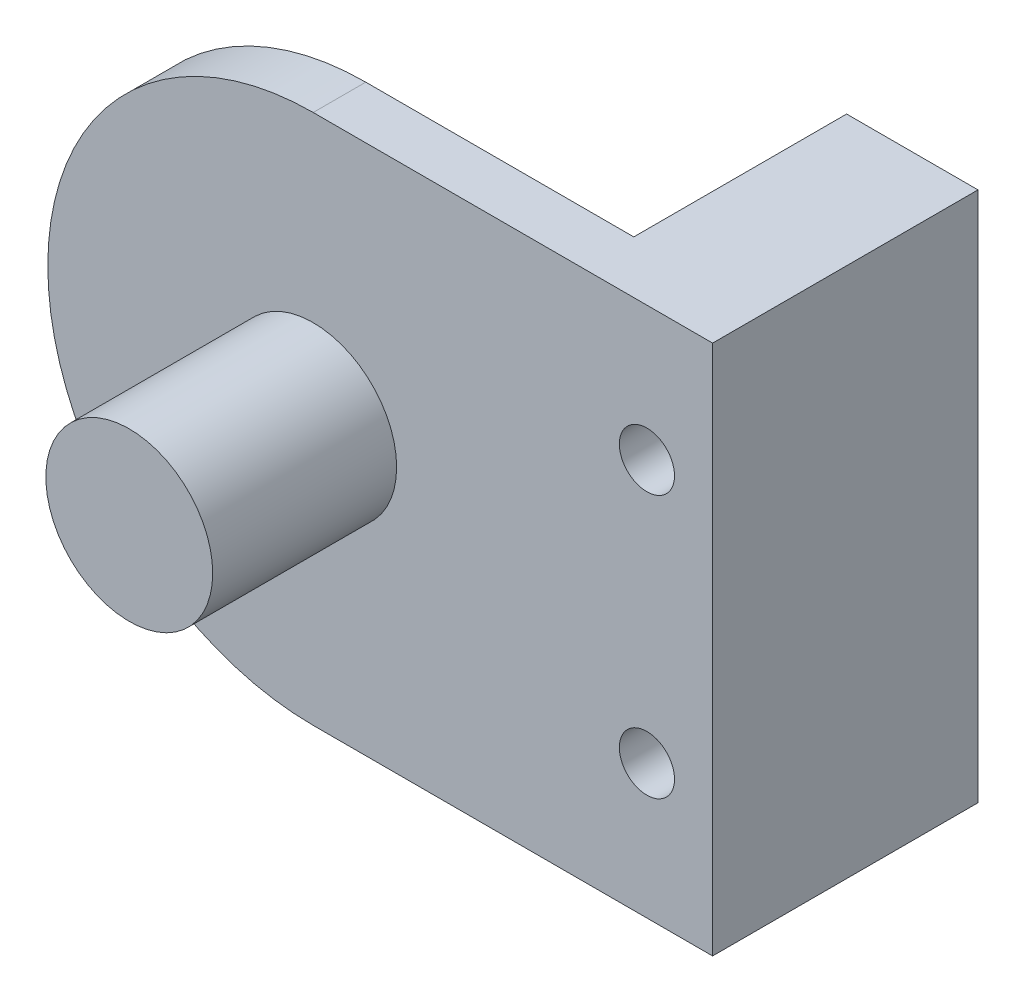
ISO-10303-21;
HEADER;
FILE_DESCRIPTION(('STEP AP214'),'2;1');
FILE_NAME('part.step','',(''),(''),'','','');
FILE_SCHEMA(('AUTOMOTIVE_DESIGN { 1 0 10303 214 1 1 1 1 }'));
ENDSEC;
DATA;
#1=APPLICATION_CONTEXT('core data for automotive mechanical design processes');
#2=APPLICATION_PROTOCOL_DEFINITION('international standard','automotive_design',2000,#1);
#3=PRODUCT_CONTEXT('',#1,'mechanical');
#4=PRODUCT('Part','Part','',(#3));
#5=PRODUCT_RELATED_PRODUCT_CATEGORY('part','',(#4));
#6=PRODUCT_DEFINITION_FORMATION('','',#4);
#7=PRODUCT_DEFINITION_CONTEXT('part definition',#1,'design');
#8=PRODUCT_DEFINITION('design','',#6,#7);
#9=PRODUCT_DEFINITION_SHAPE('','',#8);
#10=(LENGTH_UNIT() NAMED_UNIT(*) SI_UNIT(.MILLI.,.METRE.));
#11=(NAMED_UNIT(*) PLANE_ANGLE_UNIT() SI_UNIT($,.RADIAN.));
#12=(NAMED_UNIT(*) SI_UNIT($,.STERADIAN.) SOLID_ANGLE_UNIT());
#13=UNCERTAINTY_MEASURE_WITH_UNIT(LENGTH_MEASURE(1.E-05),#10,'distance_accuracy_value','');
#14=(GEOMETRIC_REPRESENTATION_CONTEXT(3) GLOBAL_UNCERTAINTY_ASSIGNED_CONTEXT((#13)) GLOBAL_UNIT_ASSIGNED_CONTEXT((#10,
#11,#12)) REPRESENTATION_CONTEXT('',''));
#15=CARTESIAN_POINT('',(0.,0.,0.));
#16=DIRECTION('',(0.,0.,1.));
#17=DIRECTION('',(1.,0.,0.));
#18=AXIS2_PLACEMENT_3D('',#15,#16,#17);
#19=CARTESIAN_POINT('',(2.5,10.1,8.1));
#20=DIRECTION('',(-1.,0.,0.));
#21=DIRECTION('',(0.,-1.,0.));
#22=AXIS2_PLACEMENT_3D('',#19,#20,#21);
#23=PLANE('',#22);
#24=DIRECTION('',(0.,1.,0.));
#25=VECTOR('',#24,1.);
#26=CARTESIAN_POINT('',(2.5,10.1,0.));
#27=LINE('',#26,#25);
#28=CARTESIAN_POINT('',(2.5,-10.1,0.));
#29=VERTEX_POINT('',#28);
#30=CARTESIAN_POINT('',(2.5,10.1,0.));
#31=VERTEX_POINT('',#30);
#32=EDGE_CURVE('E97',#29,#31,#27,.T.);
#33=ORIENTED_EDGE('',*,*,#32,.T.);
#34=DIRECTION('',(0.,0.,-1.));
#35=VECTOR('',#34,1.);
#36=CARTESIAN_POINT('',(2.5,10.1,8.1));
#37=LINE('',#36,#35);
#38=CARTESIAN_POINT('',(2.5,10.1,10.1));
#39=VERTEX_POINT('',#38);
#40=EDGE_CURVE('E11',#39,#31,#37,.T.);
#41=ORIENTED_EDGE('',*,*,#40,.F.);
#42=DIRECTION('',(0.,1.,0.));
#43=VECTOR('',#42,1.);
#44=CARTESIAN_POINT('',(2.5,10.1,10.1));
#45=LINE('',#44,#43);
#46=CARTESIAN_POINT('',(2.5,-10.1,10.1));
#47=VERTEX_POINT('',#46);
#48=EDGE_CURVE('E135',#47,#39,#45,.T.);
#49=ORIENTED_EDGE('',*,*,#48,.F.);
#50=DIRECTION('',(0.,0.,-1.));
#51=VECTOR('',#50,1.);
#52=CARTESIAN_POINT('',(2.5,-10.1,8.1));
#53=LINE('',#52,#51);
#54=EDGE_CURVE('E92',#47,#29,#53,.T.);
#55=ORIENTED_EDGE('',*,*,#54,.T.);
#56=EDGE_LOOP('',(#33,#41,#49,#55));
#57=FACE_BOUND('',#56,.T.);
#58=ADVANCED_FACE('F39',(#57),#23,.F.);
#59=CARTESIAN_POINT('',(-2.5,10.1,8.1));
#60=DIRECTION('',(0.,-1.,0.));
#61=DIRECTION('',(0.,0.,-1.));
#62=AXIS2_PLACEMENT_3D('',#59,#60,#61);
#63=PLANE('',#62);
#64=DIRECTION('',(-1.,0.,0.));
#65=VECTOR('',#64,1.);
#66=CARTESIAN_POINT('',(-2.5,10.1,0.));
#67=LINE('',#66,#65);
#68=CARTESIAN_POINT('',(-2.5,10.1,0.));
#69=VERTEX_POINT('',#68);
#70=EDGE_CURVE('E81',#31,#69,#67,.T.);
#71=ORIENTED_EDGE('',*,*,#70,.T.);
#72=DIRECTION('',(0.,0.,-1.));
#73=VECTOR('',#72,1.);
#74=CARTESIAN_POINT('',(-2.5,10.1,8.1));
#75=LINE('',#74,#73);
#76=CARTESIAN_POINT('',(-2.5,10.1,8.1));
#77=VERTEX_POINT('',#76);
#78=EDGE_CURVE('E49',#77,#69,#75,.T.);
#79=ORIENTED_EDGE('',*,*,#78,.F.);
#80=DIRECTION('',(-1.,0.,0.));
#81=VECTOR('',#80,1.);
#82=CARTESIAN_POINT('',(2.5,10.1,8.1));
#83=LINE('',#82,#81);
#84=CARTESIAN_POINT('',(-12.7,10.1,8.1));
#85=VERTEX_POINT('',#84);
#86=EDGE_CURVE('E131',#77,#85,#83,.T.);
#87=ORIENTED_EDGE('',*,*,#86,.T.);
#88=DIRECTION('',(0.,0.,-1.));
#89=VECTOR('',#88,1.);
#90=CARTESIAN_POINT('',(-12.7,10.1,10.1));
#91=LINE('',#90,#89);
#92=CARTESIAN_POINT('',(-12.7,10.1,10.1));
#93=VERTEX_POINT('',#92);
#94=EDGE_CURVE('E162',#93,#85,#91,.T.);
#95=ORIENTED_EDGE('',*,*,#94,.F.);
#96=DIRECTION('',(-1.,0.,0.));
#97=VECTOR('',#96,1.);
#98=CARTESIAN_POINT('',(2.5,10.1,10.1));
#99=LINE('',#98,#97);
#100=EDGE_CURVE('E139',#39,#93,#99,.T.);
#101=ORIENTED_EDGE('',*,*,#100,.F.);
#102=ORIENTED_EDGE('',*,*,#40,.T.);
#103=EDGE_LOOP('',(#71,#79,#87,#95,#101,#102));
#104=FACE_BOUND('',#103,.T.);
#105=ADVANCED_FACE('F168',(#104),#63,.F.);
#106=CARTESIAN_POINT('',(-2.5,10.1,8.1));
#107=DIRECTION('',(1.,0.,0.));
#108=DIRECTION('',(0.,1.,0.));
#109=AXIS2_PLACEMENT_3D('',#106,#107,#108);
#110=PLANE('',#109);
#111=DIRECTION('',(0.,-1.,0.));
#112=VECTOR('',#111,1.);
#113=CARTESIAN_POINT('',(-2.5,10.1,0.));
#114=LINE('',#113,#112);
#115=CARTESIAN_POINT('',(-2.5,-10.1,0.));
#116=VERTEX_POINT('',#115);
#117=EDGE_CURVE('E72',#69,#116,#114,.T.);
#118=ORIENTED_EDGE('',*,*,#117,.T.);
#119=DIRECTION('',(0.,0.,-1.));
#120=VECTOR('',#119,1.);
#121=CARTESIAN_POINT('',(-2.5,-10.1,8.1));
#122=LINE('',#121,#120);
#123=CARTESIAN_POINT('',(-2.5,-10.1,8.1));
#124=VERTEX_POINT('',#123);
#125=EDGE_CURVE('E75',#124,#116,#122,.T.);
#126=ORIENTED_EDGE('',*,*,#125,.F.);
#127=DIRECTION('',(0.,-1.,0.));
#128=VECTOR('',#127,1.);
#129=CARTESIAN_POINT('',(-2.5,10.1,8.1));
#130=LINE('',#129,#128);
#131=EDGE_CURVE('E99',#77,#124,#130,.T.);
#132=ORIENTED_EDGE('',*,*,#131,.F.);
#133=ORIENTED_EDGE('',*,*,#78,.T.);
#134=EDGE_LOOP('',(#118,#126,#132,#133));
#135=FACE_BOUND('',#134,.T.);
#136=ADVANCED_FACE('F74',(#135),#110,.F.);
#137=CARTESIAN_POINT('',(-2.5,-10.1,8.1));
#138=DIRECTION('',(0.,1.,0.));
#139=DIRECTION('',(0.,0.,1.));
#140=AXIS2_PLACEMENT_3D('',#137,#138,#139);
#141=PLANE('',#140);
#142=DIRECTION('',(1.,0.,0.));
#143=VECTOR('',#142,1.);
#144=CARTESIAN_POINT('',(-2.5,-10.1,0.));
#145=LINE('',#144,#143);
#146=EDGE_CURVE('E80',#116,#29,#145,.T.);
#147=ORIENTED_EDGE('',*,*,#146,.T.);
#148=ORIENTED_EDGE('',*,*,#54,.F.);
#149=DIRECTION('',(1.,0.,0.));
#150=VECTOR('',#149,1.);
#151=CARTESIAN_POINT('',(2.5,-10.1,10.1));
#152=LINE('',#151,#150);
#153=CARTESIAN_POINT('',(-12.7,-10.1,10.1));
#154=VERTEX_POINT('',#153);
#155=EDGE_CURVE('E147',#154,#47,#152,.T.);
#156=ORIENTED_EDGE('',*,*,#155,.F.);
#157=DIRECTION('',(0.,0.,-1.));
#158=VECTOR('',#157,1.);
#159=CARTESIAN_POINT('',(-12.7,-10.1,10.1));
#160=LINE('',#159,#158);
#161=CARTESIAN_POINT('',(-12.7,-10.1,8.1));
#162=VERTEX_POINT('',#161);
#163=EDGE_CURVE('E151',#154,#162,#160,.T.);
#164=ORIENTED_EDGE('',*,*,#163,.T.);
#165=DIRECTION('',(1.,0.,0.));
#166=VECTOR('',#165,1.);
#167=CARTESIAN_POINT('',(2.5,-10.1,8.1));
#168=LINE('',#167,#166);
#169=EDGE_CURVE('E90',#162,#124,#168,.T.);
#170=ORIENTED_EDGE('',*,*,#169,.T.);
#171=ORIENTED_EDGE('',*,*,#125,.T.);
#172=EDGE_LOOP('',(#147,#148,#156,#164,#170,#171));
#173=FACE_BOUND('',#172,.T.);
#174=ADVANCED_FACE('F85',(#173),#141,.F.);
#175=CARTESIAN_POINT('',(0.,0.,0.));
#176=DIRECTION('',(0.,0.,1.));
#177=DIRECTION('',(1.,0.,0.));
#178=AXIS2_PLACEMENT_3D('',#175,#176,#177);
#179=PLANE('',#178);
#180=CARTESIAN_POINT('',(0.,5.,0.));
#181=DIRECTION('',(0.,0.,-1.));
#182=DIRECTION('',(-1.,0.,0.));
#183=AXIS2_PLACEMENT_3D('',#180,#181,#182);
#184=CIRCLE('',#183,1.05);
#185=CARTESIAN_POINT('',(-1.05,5.,0.));
#186=VERTEX_POINT('',#185);
#187=EDGE_CURVE('E111',#186,#186,#184,.T.);
#188=ORIENTED_EDGE('',*,*,#187,.F.);
#189=EDGE_LOOP('',(#188));
#190=FACE_BOUND('',#189,.T.);
#191=CARTESIAN_POINT('',(-1.03877078427306E-13,-5.,0.));
#192=DIRECTION('',(0.,0.,-1.));
#193=DIRECTION('',(-1.,0.,0.));
#194=AXIS2_PLACEMENT_3D('',#191,#192,#193);
#195=CIRCLE('',#194,1.05);
#196=CARTESIAN_POINT('',(-1.0500000000001,-5.,0.));
#197=VERTEX_POINT('',#196);
#198=EDGE_CURVE('E119',#197,#197,#195,.T.);
#199=ORIENTED_EDGE('',*,*,#198,.F.);
#200=EDGE_LOOP('',(#199));
#201=FACE_BOUND('',#200,.T.);
#202=ORIENTED_EDGE('',*,*,#32,.F.);
#203=ORIENTED_EDGE('',*,*,#146,.F.);
#204=ORIENTED_EDGE('',*,*,#117,.F.);
#205=ORIENTED_EDGE('',*,*,#70,.F.);
#206=EDGE_LOOP('',(#202,#203,#204,#205));
#207=FACE_BOUND('',#206,.T.);
#208=ADVANCED_FACE('F95',(#190,#201,#207),#179,.F.);
#209=CARTESIAN_POINT('',(-12.7,0.,8.1));
#210=DIRECTION('',(0.,0.,1.));
#211=DIRECTION('',(1.,0.,0.));
#212=AXIS2_PLACEMENT_3D('',#209,#210,#211);
#213=PLANE('',#212);
#214=ORIENTED_EDGE('',*,*,#86,.F.);
#215=ORIENTED_EDGE('',*,*,#131,.T.);
#216=ORIENTED_EDGE('',*,*,#169,.F.);
#217=CARTESIAN_POINT('',(-12.7,0.,8.1));
#218=DIRECTION('',(0.,0.,1.));
#219=DIRECTION('',(1.,0.,0.));
#220=AXIS2_PLACEMENT_3D('',#217,#218,#219);
#221=CIRCLE('',#220,10.1);
#222=EDGE_CURVE('E154',#85,#162,#221,.T.);
#223=ORIENTED_EDGE('',*,*,#222,.F.);
#224=EDGE_LOOP('',(#214,#215,#216,#223));
#225=FACE_BOUND('',#224,.T.);
#226=ADVANCED_FACE('F192',(#225),#213,.F.);
#227=CARTESIAN_POINT('',(-12.7,0.,10.1));
#228=DIRECTION('',(0.,0.,-1.));
#229=DIRECTION('',(-1.,0.,0.));
#230=AXIS2_PLACEMENT_3D('',#227,#228,#229);
#231=CYLINDRICAL_SURFACE('',#230,10.1);
#232=ORIENTED_EDGE('',*,*,#222,.T.);
#233=ORIENTED_EDGE('',*,*,#163,.F.);
#234=CARTESIAN_POINT('',(-12.7,0.,10.1));
#235=DIRECTION('',(0.,0.,1.));
#236=DIRECTION('',(1.,0.,0.));
#237=AXIS2_PLACEMENT_3D('',#234,#235,#236);
#238=CIRCLE('',#237,10.1);
#239=EDGE_CURVE('E143',#93,#154,#238,.T.);
#240=ORIENTED_EDGE('',*,*,#239,.F.);
#241=ORIENTED_EDGE('',*,*,#94,.T.);
#242=EDGE_LOOP('',(#232,#233,#240,#241));
#243=FACE_BOUND('',#242,.T.);
#244=ADVANCED_FACE('F186',(#243),#231,.T.);
#245=CARTESIAN_POINT('',(-12.7,0.,10.1));
#246=DIRECTION('',(0.,0.,1.));
#247=DIRECTION('',(1.,0.,0.));
#248=AXIS2_PLACEMENT_3D('',#245,#246,#247);
#249=PLANE('',#248);
#250=CARTESIAN_POINT('',(0.,5.,10.1));
#251=DIRECTION('',(0.,0.,1.));
#252=DIRECTION('',(1.,0.,0.));
#253=AXIS2_PLACEMENT_3D('',#250,#251,#252);
#254=CIRCLE('',#253,1.05);
#255=CARTESIAN_POINT('',(1.05,5.,10.1));
#256=VERTEX_POINT('',#255);
#257=EDGE_CURVE('E42',#256,#256,#254,.T.);
#258=ORIENTED_EDGE('',*,*,#257,.F.);
#259=EDGE_LOOP('',(#258));
#260=FACE_BOUND('',#259,.T.);
#261=CARTESIAN_POINT('',(-1.03877078427306E-13,-5.,10.1));
#262=DIRECTION('',(0.,0.,1.));
#263=DIRECTION('',(1.,0.,0.));
#264=AXIS2_PLACEMENT_3D('',#261,#262,#263);
#265=CIRCLE('',#264,1.05);
#266=CARTESIAN_POINT('',(1.0499999999999,-5.,10.1));
#267=VERTEX_POINT('',#266);
#268=EDGE_CURVE('E108',#267,#267,#265,.T.);
#269=ORIENTED_EDGE('',*,*,#268,.F.);
#270=EDGE_LOOP('',(#269));
#271=FACE_BOUND('',#270,.T.);
#272=CARTESIAN_POINT('',(-12.7,0.,10.1));
#273=DIRECTION('',(0.,0.,1.));
#274=DIRECTION('',(1.,0.,0.));
#275=AXIS2_PLACEMENT_3D('',#272,#273,#274);
#276=CIRCLE('',#275,3.175);
#277=CARTESIAN_POINT('',(-9.525,0.,10.1));
#278=VERTEX_POINT('',#277);
#279=EDGE_CURVE('E117',#278,#278,#276,.T.);
#280=ORIENTED_EDGE('',*,*,#279,.F.);
#281=EDGE_LOOP('',(#280));
#282=FACE_BOUND('',#281,.T.);
#283=ORIENTED_EDGE('',*,*,#48,.T.);
#284=ORIENTED_EDGE('',*,*,#100,.T.);
#285=ORIENTED_EDGE('',*,*,#239,.T.);
#286=ORIENTED_EDGE('',*,*,#155,.T.);
#287=EDGE_LOOP('',(#283,#284,#285,#286));
#288=FACE_BOUND('',#287,.T.);
#289=ADVANCED_FACE('F180',(#260,#271,#282,#288),#249,.T.);
#290=CARTESIAN_POINT('',(-12.7,0.,17.1));
#291=DIRECTION('',(0.,0.,-1.));
#292=DIRECTION('',(-1.,0.,0.));
#293=AXIS2_PLACEMENT_3D('',#290,#291,#292);
#294=CYLINDRICAL_SURFACE('',#293,3.175);
#295=CARTESIAN_POINT('',(-12.7,0.,17.1));
#296=DIRECTION('',(0.,0.,1.));
#297=DIRECTION('',(1.,0.,0.));
#298=AXIS2_PLACEMENT_3D('',#295,#296,#297);
#299=CIRCLE('',#298,3.175);
#300=CARTESIAN_POINT('',(-9.525,0.,17.1));
#301=VERTEX_POINT('',#300);
#302=EDGE_CURVE('E127',#301,#301,#299,.T.);
#303=ORIENTED_EDGE('',*,*,#302,.F.);
#304=EDGE_LOOP('',(#303));
#305=FACE_BOUND('',#304,.T.);
#306=ORIENTED_EDGE('',*,*,#279,.T.);
#307=EDGE_LOOP('',(#306));
#308=FACE_BOUND('',#307,.T.);
#309=ADVANCED_FACE('F241',(#305,#308),#294,.T.);
#310=CARTESIAN_POINT('',(-12.7,0.,17.1));
#311=DIRECTION('',(0.,0.,1.));
#312=DIRECTION('',(1.,0.,0.));
#313=AXIS2_PLACEMENT_3D('',#310,#311,#312);
#314=PLANE('',#313);
#315=ORIENTED_EDGE('',*,*,#302,.T.);
#316=EDGE_LOOP('',(#315));
#317=FACE_BOUND('',#316,.T.);
#318=ADVANCED_FACE('F232',(#317),#314,.T.);
#319=CARTESIAN_POINT('',(-1.03877078427306E-13,-5.,17.1));
#320=DIRECTION('',(0.,0.,-1.));
#321=DIRECTION('',(-1.,0.,0.));
#322=AXIS2_PLACEMENT_3D('',#319,#320,#321);
#323=CYLINDRICAL_SURFACE('',#322,1.05);
#324=ORIENTED_EDGE('',*,*,#268,.T.);
#325=EDGE_LOOP('',(#324));
#326=FACE_BOUND('',#325,.T.);
#327=ORIENTED_EDGE('',*,*,#198,.T.);
#328=EDGE_LOOP('',(#327));
#329=FACE_BOUND('',#328,.T.);
#330=ADVANCED_FACE('F249',(#326,#329),#323,.F.);
#331=CARTESIAN_POINT('',(0.,5.,17.1));
#332=DIRECTION('',(0.,0.,-1.));
#333=DIRECTION('',(-1.,0.,0.));
#334=AXIS2_PLACEMENT_3D('',#331,#332,#333);
#335=CYLINDRICAL_SURFACE('',#334,1.05);
#336=ORIENTED_EDGE('',*,*,#257,.T.);
#337=EDGE_LOOP('',(#336));
#338=FACE_BOUND('',#337,.T.);
#339=ORIENTED_EDGE('',*,*,#187,.T.);
#340=EDGE_LOOP('',(#339));
#341=FACE_BOUND('',#340,.T.);
#342=ADVANCED_FACE('F254',(#338,#341),#335,.F.);
#343=CLOSED_SHELL('',(#58,#105,#136,#174,#208,#226,#244,#289,#309,#318,#330,#342));
#344=MANIFOLD_SOLID_BREP('B2',#343);
#345=ADVANCED_BREP_SHAPE_REPRESENTATION('',(#18,#344),#14);
#346=SHAPE_DEFINITION_REPRESENTATION(#9,#345);
ENDSEC;
END-ISO-10303-21;
